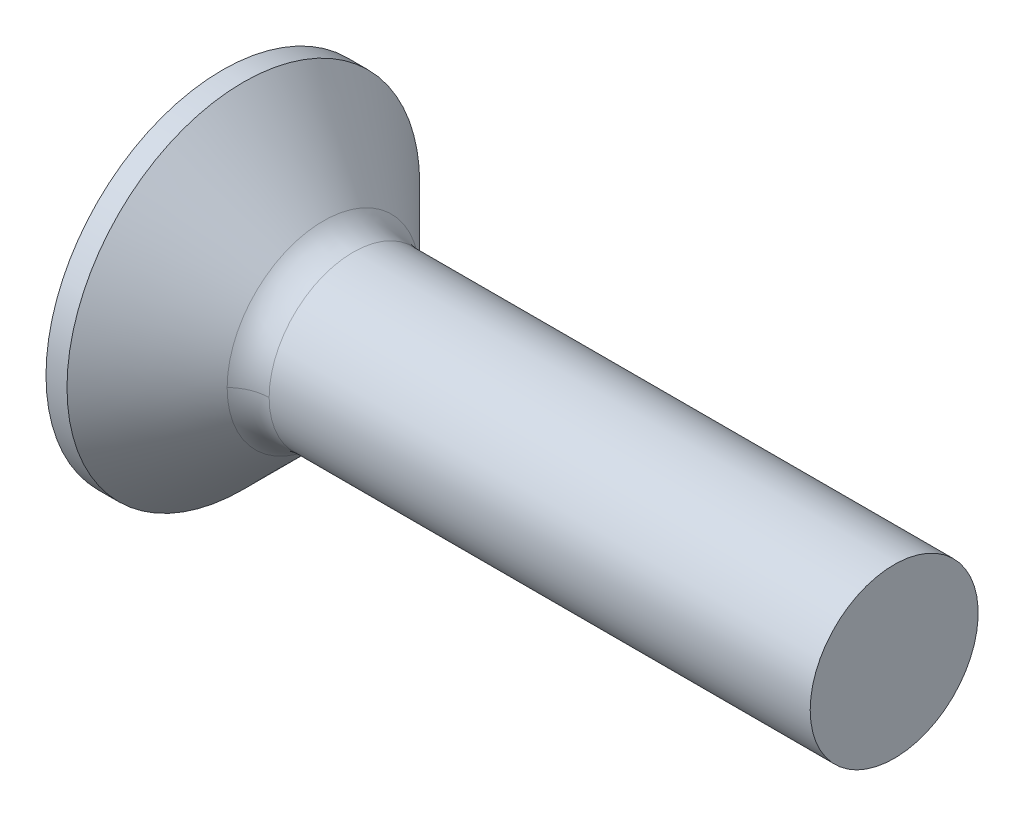
ISO-10303-21;
HEADER;
FILE_DESCRIPTION(('STEP AP214'),'2;1');
FILE_NAME('part.step','',(''),(''),'','','');
FILE_SCHEMA(('AUTOMOTIVE_DESIGN { 1 0 10303 214 1 1 1 1 }'));
ENDSEC;
DATA;
#1=APPLICATION_CONTEXT('core data for automotive mechanical design processes');
#2=APPLICATION_PROTOCOL_DEFINITION('international standard','automotive_design',2000,#1);
#3=PRODUCT_CONTEXT('',#1,'mechanical');
#4=PRODUCT('Part','Part','',(#3));
#5=PRODUCT_RELATED_PRODUCT_CATEGORY('part','',(#4));
#6=PRODUCT_DEFINITION_FORMATION('','',#4);
#7=PRODUCT_DEFINITION_CONTEXT('part definition',#1,'design');
#8=PRODUCT_DEFINITION('design','',#6,#7);
#9=PRODUCT_DEFINITION_SHAPE('','',#8);
#10=(LENGTH_UNIT() NAMED_UNIT(*) SI_UNIT(.MILLI.,.METRE.));
#11=(NAMED_UNIT(*) PLANE_ANGLE_UNIT() SI_UNIT($,.RADIAN.));
#12=(NAMED_UNIT(*) SI_UNIT($,.STERADIAN.) SOLID_ANGLE_UNIT());
#13=UNCERTAINTY_MEASURE_WITH_UNIT(LENGTH_MEASURE(1.E-05),#10,'distance_accuracy_value','');
#14=(GEOMETRIC_REPRESENTATION_CONTEXT(3) GLOBAL_UNCERTAINTY_ASSIGNED_CONTEXT((#13)) GLOBAL_UNIT_ASSIGNED_CONTEXT((#10,
#11,#12)) REPRESENTATION_CONTEXT('',''));
#15=CARTESIAN_POINT('',(0.,0.,0.));
#16=DIRECTION('',(0.,0.,1.));
#17=DIRECTION('',(1.,0.,0.));
#18=AXIS2_PLACEMENT_3D('',#15,#16,#17);
#19=CARTESIAN_POINT('',(2.51,0.,0.));
#20=DIRECTION('',(-1.,0.,0.));
#21=DIRECTION('',(0.,0.,1.));
#22=AXIS2_PLACEMENT_3D('',#19,#20,#21);
#23=CONICAL_SURFACE('',#22,0.851,0.0698131700884116);
#24=CARTESIAN_POINT('',(2.51000000000001,0.,0.));
#25=DIRECTION('',(-1.,0.,0.));
#26=DIRECTION('',(0.,0.,1.));
#27=AXIS2_PLACEMENT_3D('',#24,#25,#26);
#28=CIRCLE('',#27,0.851);
#29=CARTESIAN_POINT('',(2.51000000000001,0.515000000128447,-0.677477674811281));
#30=VERTEX_POINT('',#29);
#31=CARTESIAN_POINT('',(2.50999999998821,0.677477674911375,-0.514999999998138));
#32=VERTEX_POINT('',#31);
#33=EDGE_CURVE('E126',#30,#32,#28,.F.);
#34=ORIENTED_EDGE('',*,*,#33,.T.);
#35=CARTESIAN_POINT('',(-7.25470712172385E-11,0.887981255320598,-0.514999999738052));
#36=CARTESIAN_POINT('',(0.318819879636719,0.862192153268574,-0.51499999990922));
#37=CARTESIAN_POINT('',(0.637620357667007,0.836153848252877,-0.514999999976439));
#38=CARTESIAN_POINT('',(1.27515765628023,0.783330183982056,-0.515000000023561));
#39=CARTESIAN_POINT('',(1.59389447718419,0.756544828595421,-0.515000000003464));
#40=CARTESIAN_POINT('',(2.01216629989946,0.720736675273492,-0.514999999998918));
#41=CARTESIAN_POINT('',(2.11173974714975,0.712163242481372,-0.514999999999459));
#42=CARTESIAN_POINT('',(2.31087725771429,0.694906260205415,-0.515000000000541));
#43=CARTESIAN_POINT('',(2.41044132101322,0.686222710544853,-0.515000000001082));
#44=CARTESIAN_POINT('',(2.50999999997648,0.677477674910992,-0.515));
#45=B_SPLINE_CURVE_WITH_KNOTS('',3,(#35,#36,#37,#38,#39,#40,#41,#42,#43,#44),.UNSPECIFIED.,.F.,
.F.,(4,2,2,2,4),(0.,0.959584754186786,1.91916454022962,2.21899005858181,2.51881605817835),.UNSPECIFIED.);
#46=CARTESIAN_POINT('',(0.,0.887981255466366,-0.515));
#47=VERTEX_POINT('',#46);
#48=EDGE_CURVE('E119',#47,#32,#45,.T.);
#49=ORIENTED_EDGE('',*,*,#48,.F.);
#50=CARTESIAN_POINT('',(0.,0.,0.));
#51=DIRECTION('',(-1.,0.,0.));
#52=DIRECTION('',(0.,0.,1.));
#53=AXIS2_PLACEMENT_3D('',#50,#51,#52);
#54=CIRCLE('',#53,1.026516298);
#55=CARTESIAN_POINT('',(-2.85935113966268E-11,0.515,-0.887981255468678));
#56=VERTEX_POINT('',#55);
#57=EDGE_CURVE('E20',#47,#56,#54,.T.);
#58=ORIENTED_EDGE('',*,*,#57,.T.);
#59=CARTESIAN_POINT('',(2.50999999998217,0.515,-0.677477674910489));
#60=CARTESIAN_POINT('',(2.24584461878122,0.515,-0.700667679814435));
#61=CARTESIAN_POINT('',(1.98165392257068,0.515,-0.723450461944113));
#62=CARTESIAN_POINT('',(1.45321766745748,0.515,-0.768360402906354));
#63=CARTESIAN_POINT('',(1.18897210874822,0.515,-0.79048756401168));
#64=CARTESIAN_POINT('',(0.770601353287124,0.515,-0.825124883970429));
#65=CARTESIAN_POINT('',(0.616489661388993,0.515,-0.837798921148617));
#66=CARTESIAN_POINT('',(0.308253737302725,0.515,-0.862997437699919));
#67=CARTESIAN_POINT('',(0.154129505090094,0.515,-0.875521916773493));
#68=CARTESIAN_POINT('',(-5.6932000135886E-11,0.515,-0.887981255470971));
#69=B_SPLINE_CURVE_WITH_KNOTS('',3,(#59,#60,#61,#62,#63,#64,#65,#66,#67,#68),.UNSPECIFIED.,.F.,
.F.,(4,2,2,2,4),(0.,0.795513110102209,1.59102346217274,2.05491931016661,2.51881608711106),.UNSPECIFIED.);
#70=EDGE_CURVE('E149',#30,#56,#69,.T.);
#71=ORIENTED_EDGE('',*,*,#70,.F.);
#72=EDGE_LOOP('',(#34,#49,#58,#71));
#73=FACE_BOUND('',#72,.T.);
#74=ADVANCED_FACE('F16',(#73),#23,.F.);
#75=CARTESIAN_POINT('',(0.,0.668342541,-0.515));
#76=DIRECTION('',(0.,0.,1.));
#77=DIRECTION('',(1.,0.,0.));
#78=AXIS2_PLACEMENT_3D('',#75,#76,#77);
#79=PLANE('',#78);
#80=DIRECTION('',(0.,1.,0.));
#81=VECTOR('',#80,1.);
#82=CARTESIAN_POINT('',(2.51,1.4387388375,-0.515));
#83=LINE('',#82,#81);
#84=CARTESIAN_POINT('',(2.51,0.948560206845572,-0.515));
#85=VERTEX_POINT('',#84);
#86=EDGE_CURVE('E140',#32,#85,#83,.T.);
#87=ORIENTED_EDGE('',*,*,#86,.T.);
#88=DIRECTION('',(0.894934367754668,-0.446197800769517,0.));
#89=VECTOR('',#88,1.);
#90=CARTESIAN_POINT('',(1.255,1.5742801035,-0.515));
#91=LINE('',#90,#89);
#92=CARTESIAN_POINT('',(0.,2.19999999989061,-0.515));
#93=VERTEX_POINT('',#92);
#94=EDGE_CURVE('E123',#93,#85,#91,.T.);
#95=ORIENTED_EDGE('',*,*,#94,.F.);
#96=DIRECTION('',(0.,-1.,0.));
#97=VECTOR('',#96,1.);
#98=CARTESIAN_POINT('',(0.,1.4387388375,-0.515));
#99=LINE('',#98,#97);
#100=EDGE_CURVE('E114',#93,#47,#99,.T.);
#101=ORIENTED_EDGE('',*,*,#100,.T.);
#102=ORIENTED_EDGE('',*,*,#48,.T.);
#103=EDGE_LOOP('',(#87,#95,#101,#102));
#104=FACE_BOUND('',#103,.T.);
#105=ADVANCED_FACE('F117',(#104),#79,.T.);
#106=CARTESIAN_POINT('',(16.,-2.024,2.024));
#107=DIRECTION('',(1.,0.,0.));
#108=DIRECTION('',(0.,0.,-1.));
#109=AXIS2_PLACEMENT_3D('',#106,#107,#108);
#110=PLANE('',#109);
#111=CARTESIAN_POINT('',(16.,0.,0.));
#112=DIRECTION('',(-1.,0.,0.));
#113=DIRECTION('',(0.,0.,1.));
#114=AXIS2_PLACEMENT_3D('',#111,#112,#113);
#115=CIRCLE('',#114,2.);
#116=CARTESIAN_POINT('',(16.,0.,2.));
#117=VERTEX_POINT('',#116);
#118=EDGE_CURVE('E381',#117,#117,#115,.F.);
#119=ORIENTED_EDGE('',*,*,#118,.T.);
#120=EDGE_LOOP('',(#119));
#121=FACE_BOUND('',#120,.T.);
#122=ADVANCED_FACE('F520',(#121),#110,.T.);
#123=CARTESIAN_POINT('',(0.,0.515,-2.209135134));
#124=DIRECTION('',(0.,-1.,0.));
#125=DIRECTION('',(1.,0.,0.));
#126=AXIS2_PLACEMENT_3D('',#123,#124,#125);
#127=PLANE('',#126);
#128=DIRECTION('',(0.,0.,-1.));
#129=VECTOR('',#128,1.);
#130=CARTESIAN_POINT('',(0.,0.515,-1.4387388375));
#131=LINE('',#130,#129);
#132=CARTESIAN_POINT('',(0.,0.515,-2.19999999989061));
#133=VERTEX_POINT('',#132);
#134=EDGE_CURVE('E135',#56,#133,#131,.T.);
#135=ORIENTED_EDGE('',*,*,#134,.T.);
#136=DIRECTION('',(-0.894934367754668,0.,-0.446197800769517));
#137=VECTOR('',#136,1.);
#138=CARTESIAN_POINT('',(1.255,0.515,-1.5742801035));
#139=LINE('',#138,#137);
#140=CARTESIAN_POINT('',(2.51,0.515,-0.948560206845572));
#141=VERTEX_POINT('',#140);
#142=EDGE_CURVE('E363',#141,#133,#139,.T.);
#143=ORIENTED_EDGE('',*,*,#142,.F.);
#144=DIRECTION('',(0.,0.,1.));
#145=VECTOR('',#144,1.);
#146=CARTESIAN_POINT('',(2.51,0.515,-1.4387388375));
#147=LINE('',#146,#145);
#148=EDGE_CURVE('E141',#141,#30,#147,.T.);
#149=ORIENTED_EDGE('',*,*,#148,.T.);
#150=ORIENTED_EDGE('',*,*,#70,.T.);
#151=EDGE_LOOP('',(#135,#143,#149,#150));
#152=FACE_BOUND('',#151,.T.);
#153=ADVANCED_FACE('F553',(#152),#127,.T.);
#154=CARTESIAN_POINT('',(0.,2.2,-0.515));
#155=DIRECTION('',(-0.446197800769517,-0.894934367754668,0.));
#156=DIRECTION('',(0.894934367754668,-0.446197800769517,0.));
#157=AXIS2_PLACEMENT_3D('',#154,#155,#156);
#158=PLANE('',#157);
#159=ORIENTED_EDGE('',*,*,#94,.T.);
#160=DIRECTION('',(0.,0.,1.));
#161=VECTOR('',#160,1.);
#162=CARTESIAN_POINT('',(2.51,0.948560207,0.));
#163=LINE('',#162,#161);
#164=CARTESIAN_POINT('',(2.51,0.948560206768358,0.515));
#165=VERTEX_POINT('',#164);
#166=EDGE_CURVE('E379',#85,#165,#163,.T.);
#167=ORIENTED_EDGE('',*,*,#166,.T.);
#168=DIRECTION('',(0.894934367735432,-0.446197800808098,0.));
#169=VECTOR('',#168,1.);
#170=CARTESIAN_POINT('',(0.,2.19999999967182,0.515));
#171=LINE('',#170,#169);
#172=CARTESIAN_POINT('',(0.,2.19999999983591,0.515));
#173=VERTEX_POINT('',#172);
#174=EDGE_CURVE('E353',#173,#165,#171,.T.);
#175=ORIENTED_EDGE('',*,*,#174,.F.);
#176=DIRECTION('',(0.,0.,-1.));
#177=VECTOR('',#176,1.);
#178=CARTESIAN_POINT('',(0.,2.2,0.));
#179=LINE('',#178,#177);
#180=EDGE_CURVE('E374',#173,#93,#179,.T.);
#181=ORIENTED_EDGE('',*,*,#180,.T.);
#182=EDGE_LOOP('',(#159,#167,#175,#181));
#183=FACE_BOUND('',#182,.T.);
#184=ADVANCED_FACE('F165',(#183),#158,.T.);
#185=CARTESIAN_POINT('',(16.,0.,0.));
#186=DIRECTION('',(-1.,0.,0.));
#187=DIRECTION('',(0.,0.,1.));
#188=AXIS2_PLACEMENT_3D('',#185,#186,#187);
#189=CYLINDRICAL_SURFACE('',#188,2.);
#190=ORIENTED_EDGE('',*,*,#118,.F.);
#191=EDGE_LOOP('',(#190));
#192=FACE_BOUND('',#191,.T.);
#193=CARTESIAN_POINT('',(3.11421356207373,0.,0.));
#194=DIRECTION('',(1.,0.,0.));
#195=DIRECTION('',(0.,1.,0.));
#196=AXIS2_PLACEMENT_3D('',#193,#194,#195);
#197=CIRCLE('',#196,2.00000000028272);
#198=CARTESIAN_POINT('',(3.11421356205332,-2.05103428515331E-10,-2.00000000021204));
#199=VERTEX_POINT('',#198);
#200=CARTESIAN_POINT('',(3.11421356207076,-8.9793628428733E-11,2.00000000021204));
#201=VERTEX_POINT('',#200);
#202=EDGE_CURVE('E343',#199,#201,#197,.T.);
#203=ORIENTED_EDGE('',*,*,#202,.T.);
#204=CARTESIAN_POINT('',(3.11421356207373,0.,0.));
#205=DIRECTION('',(1.,0.,0.));
#206=DIRECTION('',(0.,1.,0.));
#207=AXIS2_PLACEMENT_3D('',#204,#205,#206);
#208=CIRCLE('',#207,2.00000000028272);
#209=EDGE_CURVE('E332',#201,#199,#208,.T.);
#210=ORIENTED_EDGE('',*,*,#209,.T.);
#211=EDGE_LOOP('',(#203,#210));
#212=FACE_BOUND('',#211,.T.);
#213=ADVANCED_FACE('F160',(#192,#212),#189,.T.);
#214=CARTESIAN_POINT('',(2.51,0.515,-0.948560207));
#215=DIRECTION('',(-0.446197800769517,0.,0.894934367754668));
#216=DIRECTION('',(-0.894934367754668,0.,-0.446197800769517));
#217=AXIS2_PLACEMENT_3D('',#214,#215,#216);
#218=PLANE('',#217);
#219=DIRECTION('',(-0.894934367735432,0.,-0.446197800808098));
#220=VECTOR('',#219,1.);
#221=CARTESIAN_POINT('',(2.51,-0.515,-0.948560206536716));
#222=LINE('',#221,#220);
#223=CARTESIAN_POINT('',(2.51,-0.515,-0.948560206768358));
#224=VERTEX_POINT('',#223);
#225=CARTESIAN_POINT('',(0.,-0.515,-2.19999999983591));
#226=VERTEX_POINT('',#225);
#227=EDGE_CURVE('E318',#224,#226,#222,.T.);
#228=ORIENTED_EDGE('',*,*,#227,.F.);
#229=DIRECTION('',(0.,1.,0.));
#230=VECTOR('',#229,1.);
#231=CARTESIAN_POINT('',(2.51,0.,-0.948560207));
#232=LINE('',#231,#230);
#233=EDGE_CURVE('E356',#224,#141,#232,.T.);
#234=ORIENTED_EDGE('',*,*,#233,.T.);
#235=ORIENTED_EDGE('',*,*,#142,.T.);
#236=DIRECTION('',(0.,-1.,0.));
#237=VECTOR('',#236,1.);
#238=CARTESIAN_POINT('',(0.,0.,-2.2));
#239=LINE('',#238,#237);
#240=EDGE_CURVE('E359',#133,#226,#239,.T.);
#241=ORIENTED_EDGE('',*,*,#240,.T.);
#242=EDGE_LOOP('',(#228,#234,#235,#241));
#243=FACE_BOUND('',#242,.T.);
#244=ADVANCED_FACE('F164',(#243),#218,.T.);
#245=CARTESIAN_POINT('',(0.,0.668342541,0.515));
#246=DIRECTION('',(0.,0.,-1.));
#247=DIRECTION('',(0.,1.,0.));
#248=AXIS2_PLACEMENT_3D('',#245,#246,#247);
#249=PLANE('',#248);
#250=DIRECTION('',(0.,1.,0.));
#251=VECTOR('',#250,1.);
#252=CARTESIAN_POINT('',(0.,1.4387388375,0.515));
#253=LINE('',#252,#251);
#254=CARTESIAN_POINT('',(0.,0.887981255466366,0.515));
#255=VERTEX_POINT('',#254);
#256=EDGE_CURVE('E348',#255,#173,#253,.T.);
#257=ORIENTED_EDGE('',*,*,#256,.T.);
#258=ORIENTED_EDGE('',*,*,#174,.T.);
#259=DIRECTION('',(0.,-1.,0.));
#260=VECTOR('',#259,1.);
#261=CARTESIAN_POINT('',(2.51,1.4387388375,0.515));
#262=LINE('',#261,#260);
#263=CARTESIAN_POINT('',(2.51000000000001,0.677477675015967,0.514999999859184));
#264=VERTEX_POINT('',#263);
#265=EDGE_CURVE('E354',#165,#264,#262,.T.);
#266=ORIENTED_EDGE('',*,*,#265,.T.);
#267=CARTESIAN_POINT('',(-6.23890795979364E-11,0.887981255359255,0.514999999806251));
#268=CARTESIAN_POINT('',(0.318819879644557,0.862192153281618,0.514999999932855));
#269=CARTESIAN_POINT('',(0.637620357673799,0.83615384825587,0.514999999982573));
#270=CARTESIAN_POINT('',(1.27515765628601,0.78333018397802,0.515000000017427));
#271=CARTESIAN_POINT('',(1.59389447719001,0.756544828594407,0.515000000002563));
#272=CARTESIAN_POINT('',(2.01216629990365,0.720736675273295,0.514999999999199));
#273=CARTESIAN_POINT('',(2.11173974715245,0.71216324248122,0.5149999999996));
#274=CARTESIAN_POINT('',(2.31087725771403,0.694906260205355,0.5150000000004));
#275=CARTESIAN_POINT('',(2.41044132101147,0.686222710544842,0.515000000000801));
#276=CARTESIAN_POINT('',(2.50999999997326,0.677477674911275,0.515));
#277=B_SPLINE_CURVE_WITH_KNOTS('',3,(#267,#268,#269,#270,#271,#272,#273,#274,#275,#276),
.UNSPECIFIED.,.F.,.F.,(4,2,2,2,4),(0.,0.959584754186115,1.91916454022833,2.21899005857607,
2.51881605816815),.UNSPECIFIED.);
#278=EDGE_CURVE('E200',#255,#264,#277,.T.);
#279=ORIENTED_EDGE('',*,*,#278,.F.);
#280=EDGE_LOOP('',(#257,#258,#266,#279));
#281=FACE_BOUND('',#280,.T.);
#282=ADVANCED_FACE('F173',(#281),#249,.T.);
#283=CARTESIAN_POINT('',(3.214046979,0.,2.004995835));
#284=CARTESIAN_POINT('',(3.214046979,4.009991669,2.004995835));
#285=CARTESIAN_POINT('',(3.214046979,4.009991669,-2.004995835));
#286=CARTESIAN_POINT('',(3.214046979,0.,-2.004995835));
#287=CARTESIAN_POINT('',(2.873263226,0.,1.970803409));
#288=CARTESIAN_POINT('',(2.873263226,3.941606817,1.970803409));
#289=CARTESIAN_POINT('',(2.873263226,3.941606817,-1.970803409));
#290=CARTESIAN_POINT('',(2.873263226,0.,-1.970803409));
#291=CARTESIAN_POINT('',(2.55683929,0.,2.101870494));
#292=CARTESIAN_POINT('',(2.55683929,4.203740989,2.101870494));
#293=CARTESIAN_POINT('',(2.55683929,4.203740989,-2.101870494));
#294=CARTESIAN_POINT('',(2.55683929,0.,-2.101870494));
#295=CARTESIAN_POINT('',(2.340046484,0.,2.367018693));
#296=CARTESIAN_POINT('',(2.340046484,4.734037387,2.367018693));
#297=CARTESIAN_POINT('',(2.340046484,4.734037387,-2.367018693));
#298=CARTESIAN_POINT('',(2.340046484,0.,-2.367018693));
#299=(BOUNDED_SURFACE() B_SPLINE_SURFACE(3,3,((#283,#284,#285,#286),(#287,#288,#289,#290),(#291,
#292,#293,#294),(#295,#296,#297,#298)),.UNSPECIFIED.,.F.,.F.,
.F.) B_SPLINE_SURFACE_WITH_KNOTS((4,4),(4,4),(0.,1.),(0.,1.),
.UNSPECIFIED.) GEOMETRIC_REPRESENTATION_ITEM() RATIONAL_B_SPLINE_SURFACE(((1.,0.333333333333333,
0.333333333333333,1.),(0.920706259011135,0.306902086337045,0.306902086337045,0.920706259011135),
(0.920706259011135,0.306902086337045,0.306902086337045,0.920706259011135),(1.,0.333333333333333,
0.333333333333333,1.))) REPRESENTATION_ITEM('') SURFACE());
#300=CARTESIAN_POINT('',(2.40710678099998,0.,0.));
#301=DIRECTION('',(-1.,0.,0.));
#302=DIRECTION('',(0.,0.,1.));
#303=AXIS2_PLACEMENT_3D('',#300,#301,#302);
#304=CIRCLE('',#303,2.292893219);
#305=CARTESIAN_POINT('',(2.40710678110323,-7.05420390654683E-10,-2.29289321882874));
#306=VERTEX_POINT('',#305);
#307=CARTESIAN_POINT('',(2.40710678096737,-2.05887201733649E-10,2.2928932189646));
#308=VERTEX_POINT('',#307);
#309=EDGE_CURVE('E304',#306,#308,#304,.F.);
#310=CARTESIAN_POINT('',(3.214046979,0.,2.004995835));
#311=CARTESIAN_POINT('',(2.873263226,0.,1.970803409));
#312=CARTESIAN_POINT('',(2.55683929,0.,2.101870494));
#313=CARTESIAN_POINT('',(2.340046484,0.,2.367018693));
#314=(BOUNDED_CURVE() B_SPLINE_CURVE(3,(#310,#311,#312,#313),.UNSPECIFIED.,.F.,
.F.) B_SPLINE_CURVE_WITH_KNOTS((4,4),(0.,1.),
.UNSPECIFIED.) CURVE() GEOMETRIC_REPRESENTATION_ITEM() RATIONAL_B_SPLINE_CURVE((1.,
0.920706259011135,0.920706259011135,1.)) REPRESENTATION_ITEM(''));
#315=EDGE_CURVE('E337',#308,#201,#314,.F.);
#316=CARTESIAN_POINT('',(3.214046979,0.,-2.004995835));
#317=CARTESIAN_POINT('',(2.873263226,0.,-1.970803409));
#318=CARTESIAN_POINT('',(2.55683929,0.,-2.101870494));
#319=CARTESIAN_POINT('',(2.340046484,0.,-2.367018693));
#320=(BOUNDED_CURVE() B_SPLINE_CURVE(3,(#316,#317,#318,#319),.UNSPECIFIED.,.F.,
.F.) B_SPLINE_CURVE_WITH_KNOTS((4,4),(0.,1.),
.UNSPECIFIED.) CURVE() GEOMETRIC_REPRESENTATION_ITEM() RATIONAL_B_SPLINE_CURVE((1.,
0.920706259011135,0.920706259011135,1.)) REPRESENTATION_ITEM(''));
#321=EDGE_CURVE('E323',#199,#306,#320,.T.);
#322=ORIENTED_EDGE('',*,*,#309,.T.);
#323=ORIENTED_EDGE('',*,*,#315,.T.);
#324=ORIENTED_EDGE('',*,*,#202,.F.);
#325=ORIENTED_EDGE('',*,*,#321,.T.);
#326=EDGE_LOOP('',(#322,#323,#324,#325));
#327=FACE_BOUND('',#326,.T.);
#328=ADVANCED_FACE('F167',(#327),#299,.F.);
#329=CARTESIAN_POINT('',(3.214046979,0.,-2.004995835));
#330=CARTESIAN_POINT('',(3.214046979,-4.009991669,-2.004995835));
#331=CARTESIAN_POINT('',(3.214046979,-4.009991669,2.004995835));
#332=CARTESIAN_POINT('',(3.214046979,0.,2.004995835));
#333=CARTESIAN_POINT('',(2.873263226,0.,-1.970803409));
#334=CARTESIAN_POINT('',(2.873263226,-3.941606817,-1.970803409));
#335=CARTESIAN_POINT('',(2.873263226,-3.941606817,1.970803409));
#336=CARTESIAN_POINT('',(2.873263226,0.,1.970803409));
#337=CARTESIAN_POINT('',(2.55683929,0.,-2.101870494));
#338=CARTESIAN_POINT('',(2.55683929,-4.203740989,-2.101870494));
#339=CARTESIAN_POINT('',(2.55683929,-4.203740989,2.101870494));
#340=CARTESIAN_POINT('',(2.55683929,0.,2.101870494));
#341=CARTESIAN_POINT('',(2.340046484,0.,-2.367018693));
#342=CARTESIAN_POINT('',(2.340046484,-4.734037387,-2.367018693));
#343=CARTESIAN_POINT('',(2.340046484,-4.734037387,2.367018693));
#344=CARTESIAN_POINT('',(2.340046484,0.,2.367018693));
#345=(BOUNDED_SURFACE() B_SPLINE_SURFACE(3,3,((#329,#330,#331,#332),(#333,#334,#335,#336),(#337,
#338,#339,#340),(#341,#342,#343,#344)),.UNSPECIFIED.,.F.,.F.,
.F.) B_SPLINE_SURFACE_WITH_KNOTS((4,4),(4,4),(0.,1.),(0.,1.),
.UNSPECIFIED.) GEOMETRIC_REPRESENTATION_ITEM() RATIONAL_B_SPLINE_SURFACE(((1.,0.333333333333333,
0.333333333333333,1.),(0.920706259011135,0.306902086337045,0.306902086337045,0.920706259011135),
(0.920706259011135,0.306902086337045,0.306902086337045,0.920706259011135),(1.,0.333333333333333,
0.333333333333333,1.))) REPRESENTATION_ITEM('') SURFACE());
#346=CARTESIAN_POINT('',(2.40710678099998,0.,0.));
#347=DIRECTION('',(-1.,0.,0.));
#348=DIRECTION('',(0.,0.,1.));
#349=AXIS2_PLACEMENT_3D('',#346,#347,#348);
#350=CIRCLE('',#349,2.292893219);
#351=EDGE_CURVE('E298',#308,#306,#350,.F.);
#352=ORIENTED_EDGE('',*,*,#321,.F.);
#353=ORIENTED_EDGE('',*,*,#209,.F.);
#354=ORIENTED_EDGE('',*,*,#315,.F.);
#355=ORIENTED_EDGE('',*,*,#351,.T.);
#356=EDGE_LOOP('',(#352,#353,#354,#355));
#357=FACE_BOUND('',#356,.T.);
#358=ADVANCED_FACE('F172',(#357),#345,.F.);
#359=CARTESIAN_POINT('',(0.,-0.515,-2.209135134));
#360=DIRECTION('',(0.,1.,0.));
#361=DIRECTION('',(0.,0.,1.));
#362=AXIS2_PLACEMENT_3D('',#359,#360,#361);
#363=PLANE('',#362);
#364=DIRECTION('',(0.,0.,-1.));
#365=VECTOR('',#364,1.);
#366=CARTESIAN_POINT('',(2.51,-0.515,-1.4387388375));
#367=LINE('',#366,#365);
#368=CARTESIAN_POINT('',(2.51000000000001,-0.515000000067614,-0.677477674857525));
#369=VERTEX_POINT('',#368);
#370=EDGE_CURVE('E319',#369,#224,#367,.T.);
#371=ORIENTED_EDGE('',*,*,#370,.T.);
#372=ORIENTED_EDGE('',*,*,#227,.T.);
#373=DIRECTION('',(0.,0.,1.));
#374=VECTOR('',#373,1.);
#375=CARTESIAN_POINT('',(0.,-0.515,-1.4387388375));
#376=LINE('',#375,#374);
#377=CARTESIAN_POINT('',(-2.98730558439721E-11,-0.515,-0.887981255468781));
#378=VERTEX_POINT('',#377);
#379=EDGE_CURVE('E321',#226,#378,#376,.T.);
#380=ORIENTED_EDGE('',*,*,#379,.T.);
#381=CARTESIAN_POINT('',(2.50999999998707,-0.515,-0.677477674910059));
#382=CARTESIAN_POINT('',(2.24584461878623,-0.515,-0.700667679814001));
#383=CARTESIAN_POINT('',(1.98165392257579,-0.515,-0.723450461943674));
#384=CARTESIAN_POINT('',(1.45321766746281,-0.515,-0.768360402905906));
#385=CARTESIAN_POINT('',(1.18897210875365,-0.515,-0.790487564011227));
#386=CARTESIAN_POINT('',(0.77060135329132,-0.515,-0.825124883970084));
#387=CARTESIAN_POINT('',(0.616489661391847,-0.515,-0.837798921148383));
#388=CARTESIAN_POINT('',(0.308253737302892,-0.515,-0.862997437699906));
#389=CARTESIAN_POINT('',(0.154129505088917,-0.515,-0.875521916773589));
#390=CARTESIAN_POINT('',(-5.94528920877672E-11,-0.515,-0.887981255471175));
#391=B_SPLINE_CURVE_WITH_KNOTS('',3,(#381,#382,#383,#384,#385,#386,#387,#388,#389,#390),
.UNSPECIFIED.,.F.,.F.,(4,2,2,2,4),(0.,0.795513110101889,1.5910234621721,2.05491931017002,
2.5188160871185),.UNSPECIFIED.);
#392=EDGE_CURVE('E290',#369,#378,#391,.T.);
#393=ORIENTED_EDGE('',*,*,#392,.F.);
#394=EDGE_LOOP('',(#371,#372,#380,#393));
#395=FACE_BOUND('',#394,.T.);
#396=ADVANCED_FACE('F184',(#395),#363,.T.);
#397=CARTESIAN_POINT('',(2.51,0.,0.));
#398=DIRECTION('',(-1.,0.,0.));
#399=DIRECTION('',(0.,0.,1.));
#400=AXIS2_PLACEMENT_3D('',#397,#398,#399);
#401=CONICAL_SURFACE('',#400,0.851,0.0698131700884116);
#402=CARTESIAN_POINT('',(0.,0.,0.));
#403=DIRECTION('',(-1.,0.,0.));
#404=DIRECTION('',(0.,0.,1.));
#405=AXIS2_PLACEMENT_3D('',#402,#403,#404);
#406=CIRCLE('',#405,1.026516298);
#407=CARTESIAN_POINT('',(0.,0.515,0.887981255466366));
#408=VERTEX_POINT('',#407);
#409=EDGE_CURVE('E317',#408,#255,#406,.T.);
#410=ORIENTED_EDGE('',*,*,#409,.T.);
#411=ORIENTED_EDGE('',*,*,#278,.T.);
#412=CARTESIAN_POINT('',(2.51000000000001,0.,0.));
#413=DIRECTION('',(-1.,0.,0.));
#414=DIRECTION('',(0.,0.,1.));
#415=AXIS2_PLACEMENT_3D('',#412,#413,#414);
#416=CIRCLE('',#415,0.851);
#417=CARTESIAN_POINT('',(2.50999999998668,0.514999999928661,0.677477674964324));
#418=VERTEX_POINT('',#417);
#419=EDGE_CURVE('E314',#264,#418,#416,.F.);
#420=ORIENTED_EDGE('',*,*,#419,.T.);
#421=CARTESIAN_POINT('',(-6.26901258969882E-11,0.514999999808638,0.887981255360661));
#422=CARTESIAN_POINT('',(0.31881987964419,0.514999999933682,0.862192153282127));
#423=CARTESIAN_POINT('',(0.637620357673408,0.514999999982788,0.836153848256026));
#424=CARTESIAN_POINT('',(1.27515765628561,0.515000000017212,0.783330183977929));
#425=CARTESIAN_POINT('',(1.59389447718963,0.515000000002531,0.756544828594421));
#426=CARTESIAN_POINT('',(2.01216629990336,0.514999999999209,0.720736675273325));
#427=CARTESIAN_POINT('',(2.11173974715225,0.514999999999605,0.712163242481241));
#428=CARTESIAN_POINT('',(2.31087725771398,0.515000000000395,0.694906260205356));
#429=CARTESIAN_POINT('',(2.41044132101151,0.515000000000791,0.686222710544833));
#430=CARTESIAN_POINT('',(2.50999999997338,0.515,0.677477674911264));
#431=B_SPLINE_CURVE_WITH_KNOTS('',3,(#421,#422,#423,#424,#425,#426,#427,#428,#429,#430),
.UNSPECIFIED.,.F.,.F.,(4,2,2,2,4),(0.,0.959584754186134,1.91916454022837,2.21899005857636,
2.51881605816869),.UNSPECIFIED.);
#432=EDGE_CURVE('E208',#408,#418,#431,.T.);
#433=ORIENTED_EDGE('',*,*,#432,.F.);
#434=EDGE_LOOP('',(#410,#411,#420,#433));
#435=FACE_BOUND('',#434,.T.);
#436=ADVANCED_FACE('F186',(#435),#401,.F.);
#437=CARTESIAN_POINT('',(2.407106781,0.,0.));
#438=DIRECTION('',(-1.,0.,0.));
#439=DIRECTION('',(0.,0.,1.));
#440=AXIS2_PLACEMENT_3D('',#437,#438,#439);
#441=CONICAL_SURFACE('',#440,2.292893219,0.785398163397448);
#442=ORIENTED_EDGE('',*,*,#351,.F.);
#443=ORIENTED_EDGE('',*,*,#309,.F.);
#444=EDGE_LOOP('',(#442,#443));
#445=FACE_BOUND('',#444,.T.);
#446=CARTESIAN_POINT('',(0.5,0.,0.));
#447=DIRECTION('',(-1.,0.,0.));
#448=DIRECTION('',(0.,0.,1.));
#449=AXIS2_PLACEMENT_3D('',#446,#447,#448);
#450=CIRCLE('',#449,4.2);
#451=CARTESIAN_POINT('',(0.5,0.,4.2));
#452=VERTEX_POINT('',#451);
#453=EDGE_CURVE('E310',#452,#452,#450,.F.);
#454=ORIENTED_EDGE('',*,*,#453,.T.);
#455=EDGE_LOOP('',(#454));
#456=FACE_BOUND('',#455,.T.);
#457=ADVANCED_FACE('F195',(#445,#456),#441,.T.);
#458=CARTESIAN_POINT('',(2.51,0.,0.));
#459=DIRECTION('',(-1.,0.,0.));
#460=DIRECTION('',(0.,0.,1.));
#461=AXIS2_PLACEMENT_3D('',#458,#459,#460);
#462=CONICAL_SURFACE('',#461,0.851,0.0698131700884116);
#463=CARTESIAN_POINT('',(0.,0.,0.));
#464=DIRECTION('',(-1.,0.,0.));
#465=DIRECTION('',(0.,0.,1.));
#466=AXIS2_PLACEMENT_3D('',#463,#464,#465);
#467=CIRCLE('',#466,1.026516298);
#468=CARTESIAN_POINT('',(0.,-0.887981256473654,-0.514999998263199));
#469=VERTEX_POINT('',#468);
#470=EDGE_CURVE('E224',#378,#469,#467,.T.);
#471=ORIENTED_EDGE('',*,*,#470,.T.);
#472=CARTESIAN_POINT('',(2.5099999999791,-0.677477674910759,-0.515));
#473=CARTESIAN_POINT('',(2.24584461877809,-0.700667679814707,-0.515));
#474=CARTESIAN_POINT('',(1.98165392256748,-0.723450461944388,-0.515));
#475=CARTESIAN_POINT('',(1.45321766745415,-0.768360402906635,-0.515));
#476=CARTESIAN_POINT('',(1.18897210874481,-0.790487564011964,-0.515));
#477=CARTESIAN_POINT('',(0.770601353275102,-0.825124883971423,-0.515));
#478=CARTESIAN_POINT('',(0.616489661368421,-0.837798921150308,-0.515));
#479=CARTESIAN_POINT('',(0.308253737265049,-0.862997437702989,-0.515));
#480=CARTESIAN_POINT('',(0.154129505043866,-0.875521916777246,-0.515));
#481=CARTESIAN_POINT('',(-1.11713501698456E-10,-0.887981255475399,-0.515));
#482=B_SPLINE_CURVE_WITH_KNOTS('',3,(#472,#473,#474,#475,#476,#477,#478,#479,#480,#481),
.UNSPECIFIED.,.F.,.F.,(4,2,2,2,4),(0.,0.79551311010241,1.59102346217314,2.05491931019275,
2.51881608716294),.UNSPECIFIED.);
#483=CARTESIAN_POINT('',(2.51000000000001,-0.677477674864095,-0.51500000005897));
#484=VERTEX_POINT('',#483);
#485=EDGE_CURVE('E218',#484,#469,#482,.T.);
#486=ORIENTED_EDGE('',*,*,#485,.F.);
#487=CARTESIAN_POINT('',(2.51000000000001,0.,0.));
#488=DIRECTION('',(-1.,0.,0.));
#489=DIRECTION('',(0.,0.,1.));
#490=AXIS2_PLACEMENT_3D('',#487,#488,#489);
#491=CIRCLE('',#490,0.851);
#492=EDGE_CURVE('E295',#484,#369,#491,.F.);
#493=ORIENTED_EDGE('',*,*,#492,.T.);
#494=ORIENTED_EDGE('',*,*,#392,.T.);
#495=EDGE_LOOP('',(#471,#486,#493,#494));
#496=FACE_BOUND('',#495,.T.);
#497=ADVANCED_FACE('F230',(#496),#462,.F.);
#498=CARTESIAN_POINT('',(0.,0.515,0.668342541));
#499=DIRECTION('',(0.,-1.,0.));
#500=DIRECTION('',(1.,0.,0.));
#501=AXIS2_PLACEMENT_3D('',#498,#499,#500);
#502=PLANE('',#501);
#503=DIRECTION('',(0.,0.,1.));
#504=VECTOR('',#503,1.);
#505=CARTESIAN_POINT('',(2.51,0.515,1.4387388375));
#506=LINE('',#505,#504);
#507=CARTESIAN_POINT('',(2.51,0.515,0.948560206845572));
#508=VERTEX_POINT('',#507);
#509=EDGE_CURVE('E216',#418,#508,#506,.T.);
#510=ORIENTED_EDGE('',*,*,#509,.T.);
#511=DIRECTION('',(0.894934367754668,0.,-0.446197800769517));
#512=VECTOR('',#511,1.);
#513=CARTESIAN_POINT('',(1.255,0.515,1.5742801035));
#514=LINE('',#513,#512);
#515=CARTESIAN_POINT('',(-1.78042765715721E-10,0.514999998842133,2.20000000042524));
#516=VERTEX_POINT('',#515);
#517=EDGE_CURVE('E455',#516,#508,#514,.T.);
#518=ORIENTED_EDGE('',*,*,#517,.F.);
#519=DIRECTION('',(0.,0.,-1.));
#520=VECTOR('',#519,1.);
#521=CARTESIAN_POINT('',(0.,0.515,1.4387388375));
#522=LINE('',#521,#520);
#523=EDGE_CURVE('E217',#516,#408,#522,.T.);
#524=ORIENTED_EDGE('',*,*,#523,.T.);
#525=ORIENTED_EDGE('',*,*,#432,.T.);
#526=EDGE_LOOP('',(#510,#518,#524,#525));
#527=FACE_BOUND('',#526,.T.);
#528=ADVANCED_FACE('F225',(#527),#502,.T.);
#529=CARTESIAN_POINT('',(0.5,0.,0.));
#530=DIRECTION('',(-1.,0.,0.));
#531=DIRECTION('',(0.,0.,1.));
#532=AXIS2_PLACEMENT_3D('',#529,#530,#531);
#533=CYLINDRICAL_SURFACE('',#532,4.2);
#534=ORIENTED_EDGE('',*,*,#453,.F.);
#535=EDGE_LOOP('',(#534));
#536=FACE_BOUND('',#535,.T.);
#537=CARTESIAN_POINT('',(0.,0.,0.));
#538=DIRECTION('',(-1.,0.,0.));
#539=DIRECTION('',(0.,0.,1.));
#540=AXIS2_PLACEMENT_3D('',#537,#538,#539);
#541=CIRCLE('',#540,4.2);
#542=CARTESIAN_POINT('',(0.,0.,4.2));
#543=VERTEX_POINT('',#542);
#544=EDGE_CURVE('E454',#543,#543,#541,.T.);
#545=ORIENTED_EDGE('',*,*,#544,.F.);
#546=EDGE_LOOP('',(#545));
#547=FACE_BOUND('',#546,.T.);
#548=ADVANCED_FACE('F229',(#536,#547),#533,.T.);
#549=CARTESIAN_POINT('',(0.,-2.209135134,-0.515));
#550=DIRECTION('',(0.,0.,1.));
#551=DIRECTION('',(1.,0.,0.));
#552=AXIS2_PLACEMENT_3D('',#549,#550,#551);
#553=PLANE('',#552);
#554=DIRECTION('',(0.,1.,0.));
#555=VECTOR('',#554,1.);
#556=CARTESIAN_POINT('',(0.,0.,-0.514999996526399));
#557=LINE('',#556,#555);
#558=CARTESIAN_POINT('',(0.,-2.20000000044587,-0.514999998842133));
#559=VERTEX_POINT('',#558);
#560=EDGE_CURVE('E443',#559,#469,#557,.T.);
#561=ORIENTED_EDGE('',*,*,#560,.F.);
#562=DIRECTION('',(-0.894934367754668,-0.446197800769517,0.));
#563=VECTOR('',#562,1.);
#564=CARTESIAN_POINT('',(1.255,-1.5742801035,-0.515));
#565=LINE('',#564,#563);
#566=CARTESIAN_POINT('',(2.51,-0.948560206845572,-0.515));
#567=VERTEX_POINT('',#566);
#568=EDGE_CURVE('E440',#567,#559,#565,.T.);
#569=ORIENTED_EDGE('',*,*,#568,.F.);
#570=DIRECTION('',(0.,1.,0.));
#571=VECTOR('',#570,1.);
#572=CARTESIAN_POINT('',(2.51,-1.4387388375,-0.515));
#573=LINE('',#572,#571);
#574=EDGE_CURVE('E313',#567,#484,#573,.T.);
#575=ORIENTED_EDGE('',*,*,#574,.T.);
#576=ORIENTED_EDGE('',*,*,#485,.T.);
#577=EDGE_LOOP('',(#561,#569,#575,#576));
#578=FACE_BOUND('',#577,.T.);
#579=ADVANCED_FACE('F233',(#578),#553,.T.);
#580=CARTESIAN_POINT('',(0.,0.515,2.2));
#581=DIRECTION('',(-0.446197800769517,0.,-0.894934367754668));
#582=DIRECTION('',(0.894934367754668,0.,-0.446197800769517));
#583=AXIS2_PLACEMENT_3D('',#580,#581,#582);
#584=PLANE('',#583);
#585=ORIENTED_EDGE('',*,*,#517,.T.);
#586=DIRECTION('',(0.,-1.,0.));
#587=VECTOR('',#586,1.);
#588=CARTESIAN_POINT('',(2.51,0.,0.948560207));
#589=LINE('',#588,#587);
#590=CARTESIAN_POINT('',(2.51,-0.515,0.948560206768358));
#591=VERTEX_POINT('',#590);
#592=EDGE_CURVE('E452',#508,#591,#589,.T.);
#593=ORIENTED_EDGE('',*,*,#592,.T.);
#594=DIRECTION('',(0.894934367735432,0.,-0.446197800808098));
#595=VECTOR('',#594,1.);
#596=CARTESIAN_POINT('',(0.,-0.515,2.19999999967182));
#597=LINE('',#596,#595);
#598=CARTESIAN_POINT('',(0.,-0.515,2.20000000050471));
#599=VERTEX_POINT('',#598);
#600=EDGE_CURVE('E423',#599,#591,#597,.T.);
#601=ORIENTED_EDGE('',*,*,#600,.F.);
#602=DIRECTION('',(0.,-1.,0.));
#603=VECTOR('',#602,1.);
#604=CARTESIAN_POINT('',(0.,0.,2.2000000013376));
#605=LINE('',#604,#603);
#606=EDGE_CURVE('E446',#516,#599,#605,.T.);
#607=ORIENTED_EDGE('',*,*,#606,.F.);
#608=EDGE_LOOP('',(#585,#593,#601,#607));
#609=FACE_BOUND('',#608,.T.);
#610=ADVANCED_FACE('F237',(#609),#584,.T.);
#611=CARTESIAN_POINT('',(0.,-4.2504,-4.2504));
#612=DIRECTION('',(-1.,0.,0.));
#613=DIRECTION('',(0.,0.,1.));
#614=AXIS2_PLACEMENT_3D('',#611,#612,#613);
#615=PLANE('',#614);
#616=ORIENTED_EDGE('',*,*,#523,.F.);
#617=ORIENTED_EDGE('',*,*,#606,.T.);
#618=DIRECTION('',(0.,0.,1.));
#619=VECTOR('',#618,1.);
#620=CARTESIAN_POINT('',(0.,-0.515,1.4387388375));
#621=LINE('',#620,#619);
#622=CARTESIAN_POINT('',(0.,-0.515,0.887981255466366));
#623=VERTEX_POINT('',#622);
#624=EDGE_CURVE('E425',#623,#599,#621,.T.);
#625=ORIENTED_EDGE('',*,*,#624,.F.);
#626=CARTESIAN_POINT('',(0.,0.,0.));
#627=DIRECTION('',(-1.,0.,0.));
#628=DIRECTION('',(0.,0.,1.));
#629=AXIS2_PLACEMENT_3D('',#626,#627,#628);
#630=CIRCLE('',#629,1.026516298);
#631=CARTESIAN_POINT('',(0.,-0.887981255466366,0.515));
#632=VERTEX_POINT('',#631);
#633=EDGE_CURVE('E411',#623,#632,#630,.F.);
#634=ORIENTED_EDGE('',*,*,#633,.T.);
#635=DIRECTION('',(0.,1.,0.));
#636=VECTOR('',#635,1.);
#637=CARTESIAN_POINT('',(0.,-1.4387388375,0.515));
#638=LINE('',#637,#636);
#639=CARTESIAN_POINT('',(0.,-2.19999999983591,0.515));
#640=VERTEX_POINT('',#639);
#641=EDGE_CURVE('E419',#640,#632,#638,.T.);
#642=ORIENTED_EDGE('',*,*,#641,.F.);
#643=DIRECTION('',(0.,0.,1.));
#644=VECTOR('',#643,1.);
#645=CARTESIAN_POINT('',(0.,-2.2,0.));
#646=LINE('',#645,#644);
#647=EDGE_CURVE('E436',#559,#640,#646,.T.);
#648=ORIENTED_EDGE('',*,*,#647,.F.);
#649=ORIENTED_EDGE('',*,*,#560,.T.);
#650=ORIENTED_EDGE('',*,*,#470,.F.);
#651=ORIENTED_EDGE('',*,*,#379,.F.);
#652=ORIENTED_EDGE('',*,*,#240,.F.);
#653=ORIENTED_EDGE('',*,*,#134,.F.);
#654=ORIENTED_EDGE('',*,*,#57,.F.);
#655=ORIENTED_EDGE('',*,*,#100,.F.);
#656=ORIENTED_EDGE('',*,*,#180,.F.);
#657=ORIENTED_EDGE('',*,*,#256,.F.);
#658=ORIENTED_EDGE('',*,*,#409,.F.);
#659=EDGE_LOOP('',(#616,#617,#625,#634,#642,#648,#649,#650,#651,#652,#653,#654,#655,#656,#657,#658));
#660=FACE_BOUND('',#659,.T.);
#661=ORIENTED_EDGE('',*,*,#544,.T.);
#662=EDGE_LOOP('',(#661));
#663=FACE_BOUND('',#662,.T.);
#664=ADVANCED_FACE('F131',(#660,#663),#615,.T.);
#665=CARTESIAN_POINT('',(2.51,-0.948560207,-0.515));
#666=DIRECTION('',(-0.446197800769517,0.894934367754668,0.));
#667=DIRECTION('',(-0.894934367754668,-0.446197800769517,0.));
#668=AXIS2_PLACEMENT_3D('',#665,#666,#667);
#669=PLANE('',#668);
#670=DIRECTION('',(-0.894934367735432,-0.446197800808098,0.));
#671=VECTOR('',#670,1.);
#672=CARTESIAN_POINT('',(2.51,-0.948560206536716,0.515));
#673=LINE('',#672,#671);
#674=CARTESIAN_POINT('',(2.51,-0.948560206768358,0.515));
#675=VERTEX_POINT('',#674);
#676=EDGE_CURVE('E421',#675,#640,#673,.T.);
#677=ORIENTED_EDGE('',*,*,#676,.F.);
#678=DIRECTION('',(0.,0.,-1.));
#679=VECTOR('',#678,1.);
#680=CARTESIAN_POINT('',(2.51,-0.948560207,0.));
#681=LINE('',#680,#679);
#682=EDGE_CURVE('E433',#675,#567,#681,.T.);
#683=ORIENTED_EDGE('',*,*,#682,.T.);
#684=ORIENTED_EDGE('',*,*,#568,.T.);
#685=ORIENTED_EDGE('',*,*,#647,.T.);
#686=EDGE_LOOP('',(#677,#683,#684,#685));
#687=FACE_BOUND('',#686,.T.);
#688=ADVANCED_FACE('F244',(#687),#669,.T.);
#689=CARTESIAN_POINT('',(2.51,0.67585118,-0.515));
#690=DIRECTION('',(-1.,0.,0.));
#691=DIRECTION('',(0.,0.,1.));
#692=AXIS2_PLACEMENT_3D('',#689,#690,#691);
#693=PLANE('',#692);
#694=ORIENTED_EDGE('',*,*,#265,.F.);
#695=ORIENTED_EDGE('',*,*,#166,.F.);
#696=ORIENTED_EDGE('',*,*,#86,.F.);
#697=CARTESIAN_POINT('',(2.51,0.,0.));
#698=DIRECTION('',(-1.,0.,0.));
#699=DIRECTION('',(0.,0.,1.));
#700=AXIS2_PLACEMENT_3D('',#697,#698,#699);
#701=CIRCLE('',#700,0.851);
#702=EDGE_CURVE('E273',#264,#32,#701,.T.);
#703=ORIENTED_EDGE('',*,*,#702,.F.);
#704=EDGE_LOOP('',(#694,#695,#696,#703));
#705=FACE_BOUND('',#704,.T.);
#706=ADVANCED_FACE('F247',(#705),#693,.T.);
#707=CARTESIAN_POINT('',(0.,-0.515,0.668342541));
#708=DIRECTION('',(0.,1.,0.));
#709=DIRECTION('',(0.,0.,1.));
#710=AXIS2_PLACEMENT_3D('',#707,#708,#709);
#711=PLANE('',#710);
#712=ORIENTED_EDGE('',*,*,#624,.T.);
#713=ORIENTED_EDGE('',*,*,#600,.T.);
#714=DIRECTION('',(0.,0.,-1.));
#715=VECTOR('',#714,1.);
#716=CARTESIAN_POINT('',(2.51,-0.515,1.4387388375));
#717=LINE('',#716,#715);
#718=CARTESIAN_POINT('',(2.50999999999095,-0.514999999989494,0.677477674917705));
#719=VERTEX_POINT('',#718);
#720=EDGE_CURVE('E35',#591,#719,#717,.T.);
#721=ORIENTED_EDGE('',*,*,#720,.T.);
#722=CARTESIAN_POINT('',(-7.7649088548156E-11,-0.514999999696975,0.887981255297232));
#723=CARTESIAN_POINT('',(0.318819879632992,-0.514999999894984,0.862192153260636));
#724=CARTESIAN_POINT('',(0.637620357663888,-0.514999999972744,0.836153848250993));
#725=CARTESIAN_POINT('',(1.27515765627767,-0.515000000027256,0.783330183984409));
#726=CARTESIAN_POINT('',(1.59389447718159,-0.515000000004008,0.756544828595956));
#727=CARTESIAN_POINT('',(2.01216629989826,-0.514999999998748,0.720736675273497));
#728=CARTESIAN_POINT('',(2.11173974714989,-0.514999999999374,0.712163242481311));
#729=CARTESIAN_POINT('',(2.31087725771711,-0.515000000000626,0.694906260205219));
#730=CARTESIAN_POINT('',(2.41044132101739,-0.515000000001252,0.686222710544588));
#731=CARTESIAN_POINT('',(2.50999999998197,-0.515,0.67747767491051));
#732=B_SPLINE_CURVE_WITH_KNOTS('',3,(#722,#723,#724,#725,#726,#727,#728,#729,#730,#731),
.UNSPECIFIED.,.F.,.F.,(4,2,2,2,4),(0.,0.959584754187123,1.91916454023027,2.21899005858648,
2.51881605818705),.UNSPECIFIED.);
#733=EDGE_CURVE('E260',#623,#719,#732,.T.);
#734=ORIENTED_EDGE('',*,*,#733,.F.);
#735=EDGE_LOOP('',(#712,#713,#721,#734));
#736=FACE_BOUND('',#735,.T.);
#737=ADVANCED_FACE('F251',(#736),#711,.T.);
#738=CARTESIAN_POINT('',(0.,-2.209135134,0.515));
#739=DIRECTION('',(0.,0.,-1.));
#740=DIRECTION('',(0.,1.,0.));
#741=AXIS2_PLACEMENT_3D('',#738,#739,#740);
#742=PLANE('',#741);
#743=DIRECTION('',(0.,1.,0.));
#744=VECTOR('',#743,1.);
#745=CARTESIAN_POINT('',(2.51,-0.8122056935,0.515));
#746=LINE('',#745,#744);
#747=CARTESIAN_POINT('',(2.50999999999626,-0.677477674805039,0.51500000013709));
#748=VERTEX_POINT('',#747);
#749=EDGE_CURVE('E268',#675,#748,#746,.T.);
#750=ORIENTED_EDGE('',*,*,#749,.F.);
#751=ORIENTED_EDGE('',*,*,#676,.T.);
#752=ORIENTED_EDGE('',*,*,#641,.T.);
#753=CARTESIAN_POINT('',(2.50999999999252,-0.67747767490958,0.515));
#754=CARTESIAN_POINT('',(2.2458446187918,-0.700667679813517,0.515));
#755=CARTESIAN_POINT('',(1.98165392258148,-0.723450461943186,0.515));
#756=CARTESIAN_POINT('',(1.45321766746874,-0.768360402905407,0.515));
#757=CARTESIAN_POINT('',(1.1889721087597,-0.790487564010722,0.515));
#758=CARTESIAN_POINT('',(0.770601353297018,-0.825124883969614,0.515));
#759=CARTESIAN_POINT('',(0.616489661397075,-0.837798921147954,0.515));
#760=CARTESIAN_POINT('',(0.308253737307182,-0.862997437699557,0.515));
#761=CARTESIAN_POINT('',(0.154129505092738,-0.875521916773279,0.515));
#762=CARTESIAN_POINT('',(-5.61004891926854E-11,-0.887981255470903,0.515));
#763=B_SPLINE_CURVE_WITH_KNOTS('',3,(#753,#754,#755,#756,#757,#758,#759,#760,#761,#762),
.UNSPECIFIED.,.F.,.F.,(4,2,2,2,4),(0.,0.795513110101533,1.59102346217139,2.05491931017072,
2.51881608712061),.UNSPECIFIED.);
#764=EDGE_CURVE('E267',#748,#632,#763,.T.);
#765=ORIENTED_EDGE('',*,*,#764,.F.);
#766=EDGE_LOOP('',(#750,#751,#752,#765));
#767=FACE_BOUND('',#766,.T.);
#768=ADVANCED_FACE('F256',(#767),#742,.T.);
#769=CARTESIAN_POINT('',(2.51,-0.515,-0.948560207));
#770=DIRECTION('',(-1.,0.,0.));
#771=DIRECTION('',(0.,0.,1.));
#772=AXIS2_PLACEMENT_3D('',#769,#770,#771);
#773=PLANE('',#772);
#774=ORIENTED_EDGE('',*,*,#148,.F.);
#775=ORIENTED_EDGE('',*,*,#233,.F.);
#776=ORIENTED_EDGE('',*,*,#370,.F.);
#777=CARTESIAN_POINT('',(2.51000000000001,0.,0.));
#778=DIRECTION('',(-1.,0.,0.));
#779=DIRECTION('',(0.,0.,1.));
#780=AXIS2_PLACEMENT_3D('',#777,#778,#779);
#781=CIRCLE('',#780,0.850999999999961);
#782=EDGE_CURVE('E405',#30,#369,#781,.T.);
#783=ORIENTED_EDGE('',*,*,#782,.F.);
#784=EDGE_LOOP('',(#774,#775,#776,#783));
#785=FACE_BOUND('',#784,.T.);
#786=ADVANCED_FACE('F555',(#785),#773,.T.);
#787=CARTESIAN_POINT('',(2.51,-0.948560207,-0.515));
#788=DIRECTION('',(-1.,0.,0.));
#789=DIRECTION('',(0.,0.,1.));
#790=AXIS2_PLACEMENT_3D('',#787,#788,#789);
#791=PLANE('',#790);
#792=ORIENTED_EDGE('',*,*,#574,.F.);
#793=ORIENTED_EDGE('',*,*,#682,.F.);
#794=ORIENTED_EDGE('',*,*,#749,.T.);
#795=CARTESIAN_POINT('',(2.51,0.,0.));
#796=DIRECTION('',(-1.,0.,0.));
#797=DIRECTION('',(0.,0.,1.));
#798=AXIS2_PLACEMENT_3D('',#795,#796,#797);
#799=CIRCLE('',#798,0.851);
#800=EDGE_CURVE('E403',#484,#748,#799,.T.);
#801=ORIENTED_EDGE('',*,*,#800,.F.);
#802=EDGE_LOOP('',(#792,#793,#794,#801));
#803=FACE_BOUND('',#802,.T.);
#804=ADVANCED_FACE('F280',(#803),#791,.T.);
#805=CARTESIAN_POINT('',(2.51,0.,0.));
#806=DIRECTION('',(-1.,0.,0.));
#807=DIRECTION('',(0.,0.,1.));
#808=AXIS2_PLACEMENT_3D('',#805,#806,#807);
#809=CONICAL_SURFACE('',#808,0.851,0.0698131700884116);
#810=CARTESIAN_POINT('',(2.51000000000001,0.,0.));
#811=DIRECTION('',(-1.,0.,0.));
#812=DIRECTION('',(0.,0.,1.));
#813=AXIS2_PLACEMENT_3D('',#810,#811,#812);
#814=CIRCLE('',#813,0.851);
#815=EDGE_CURVE('E26',#748,#719,#814,.T.);
#816=ORIENTED_EDGE('',*,*,#815,.F.);
#817=ORIENTED_EDGE('',*,*,#764,.T.);
#818=ORIENTED_EDGE('',*,*,#633,.F.);
#819=ORIENTED_EDGE('',*,*,#733,.T.);
#820=EDGE_LOOP('',(#816,#817,#818,#819));
#821=FACE_BOUND('',#820,.T.);
#822=ADVANCED_FACE('F275',(#821),#809,.F.);
#823=CARTESIAN_POINT('',(2.51,-0.515,0.67585118));
#824=DIRECTION('',(-1.,0.,0.));
#825=DIRECTION('',(0.,0.,1.));
#826=AXIS2_PLACEMENT_3D('',#823,#824,#825);
#827=PLANE('',#826);
#828=ORIENTED_EDGE('',*,*,#720,.F.);
#829=ORIENTED_EDGE('',*,*,#592,.F.);
#830=ORIENTED_EDGE('',*,*,#509,.F.);
#831=CARTESIAN_POINT('',(2.51,0.,0.));
#832=DIRECTION('',(-1.,0.,0.));
#833=DIRECTION('',(0.,0.,1.));
#834=AXIS2_PLACEMENT_3D('',#831,#832,#833);
#835=CIRCLE('',#834,0.851);
#836=EDGE_CURVE('E11',#719,#418,#835,.T.);
#837=ORIENTED_EDGE('',*,*,#836,.F.);
#838=EDGE_LOOP('',(#828,#829,#830,#837));
#839=FACE_BOUND('',#838,.T.);
#840=ADVANCED_FACE('F18',(#839),#827,.T.);
#841=CARTESIAN_POINT('',(2.786506661,0.,0.));
#842=DIRECTION('',(-1.,0.,0.));
#843=DIRECTION('',(0.,0.,1.));
#844=AXIS2_PLACEMENT_3D('',#841,#842,#843);
#845=CONICAL_SURFACE('',#844,0.,1.25663706196119);
#846=CARTESIAN_POINT('',(2.786506661,0.,0.));
#847=VERTEX_POINT('',#846);
#848=VERTEX_LOOP('',#847);
#849=FACE_BOUND('',#848,.T.);
#850=ORIENTED_EDGE('',*,*,#815,.T.);
#851=ORIENTED_EDGE('',*,*,#836,.T.);
#852=ORIENTED_EDGE('',*,*,#419,.F.);
#853=ORIENTED_EDGE('',*,*,#702,.T.);
#854=ORIENTED_EDGE('',*,*,#33,.F.);
#855=ORIENTED_EDGE('',*,*,#782,.T.);
#856=ORIENTED_EDGE('',*,*,#492,.F.);
#857=ORIENTED_EDGE('',*,*,#800,.T.);
#858=EDGE_LOOP('',(#850,#851,#852,#853,#854,#855,#856,#857));
#859=FACE_BOUND('',#858,.T.);
#860=ADVANCED_FACE('F282',(#849,#859),#845,.F.);
#861=CLOSED_SHELL('',(#74,#105,#122,#153,#184,#213,#244,#282,#328,#358,#396,#436,#457,#497,#528,
#548,#579,#610,#664,#688,#706,#737,#768,#786,#804,#822,#840,#860));
#862=MANIFOLD_SOLID_BREP('B1',#861);
#863=ADVANCED_BREP_SHAPE_REPRESENTATION('',(#18,#862),#14);
#864=SHAPE_DEFINITION_REPRESENTATION(#9,#863);
ENDSEC;
END-ISO-10303-21;
